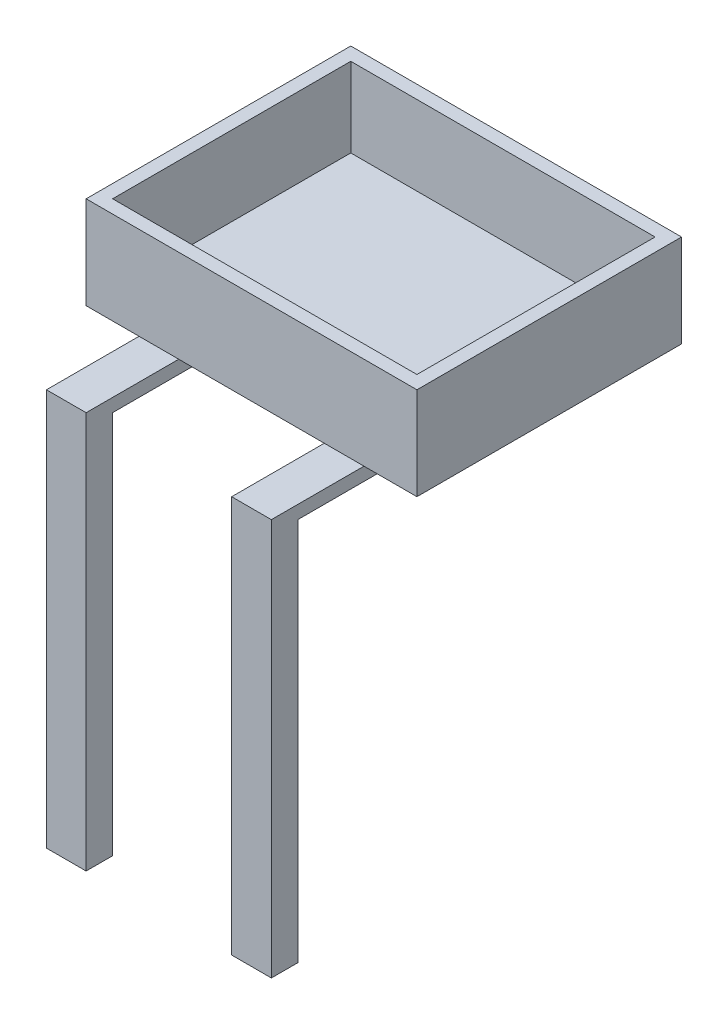
ISO-10303-21;
HEADER;
FILE_DESCRIPTION(('STEP AP214'),'2;1');
FILE_NAME('part.step','',(''),(''),'','','');
FILE_SCHEMA(('AUTOMOTIVE_DESIGN { 1 0 10303 214 1 1 1 1 }'));
ENDSEC;
DATA;
#1=APPLICATION_CONTEXT('core data for automotive mechanical design processes');
#2=APPLICATION_PROTOCOL_DEFINITION('international standard','automotive_design',2000,#1);
#3=PRODUCT_CONTEXT('',#1,'mechanical');
#4=PRODUCT('Part','Part','',(#3));
#5=PRODUCT_RELATED_PRODUCT_CATEGORY('part','',(#4));
#6=PRODUCT_DEFINITION_FORMATION('','',#4);
#7=PRODUCT_DEFINITION_CONTEXT('part definition',#1,'design');
#8=PRODUCT_DEFINITION('design','',#6,#7);
#9=PRODUCT_DEFINITION_SHAPE('','',#8);
#10=(LENGTH_UNIT() NAMED_UNIT(*) SI_UNIT(.MILLI.,.METRE.));
#11=(NAMED_UNIT(*) PLANE_ANGLE_UNIT() SI_UNIT($,.RADIAN.));
#12=(NAMED_UNIT(*) SI_UNIT($,.STERADIAN.) SOLID_ANGLE_UNIT());
#13=UNCERTAINTY_MEASURE_WITH_UNIT(LENGTH_MEASURE(1.E-05),#10,'distance_accuracy_value','');
#14=(GEOMETRIC_REPRESENTATION_CONTEXT(3) GLOBAL_UNCERTAINTY_ASSIGNED_CONTEXT((#13)) GLOBAL_UNIT_ASSIGNED_CONTEXT((#10,
#11,#12)) REPRESENTATION_CONTEXT('',''));
#15=CARTESIAN_POINT('',(0.,0.,0.));
#16=DIRECTION('',(0.,0.,1.));
#17=DIRECTION('',(1.,0.,0.));
#18=AXIS2_PLACEMENT_3D('',#15,#16,#17);
#19=CARTESIAN_POINT('',(0.,-10.,0.));
#20=DIRECTION('',(0.,1.,0.));
#21=DIRECTION('',(0.,0.,1.));
#22=AXIS2_PLACEMENT_3D('',#19,#20,#21);
#23=PLANE('',#22);
#24=DIRECTION('',(1.,0.,0.));
#25=VECTOR('',#24,1.);
#26=CARTESIAN_POINT('',(55.,-10.,150.));
#27=LINE('',#26,#25);
#28=CARTESIAN_POINT('',(55.,-10.,150.));
#29=VERTEX_POINT('',#28);
#30=CARTESIAN_POINT('',(85.,-10.,150.));
#31=VERTEX_POINT('',#30);
#32=EDGE_CURVE('E67',#29,#31,#27,.T.);
#33=ORIENTED_EDGE('',*,*,#32,.F.);
#34=DIRECTION('',(0.,0.,-1.));
#35=VECTOR('',#34,1.);
#36=CARTESIAN_POINT('',(55.,-10.,-100.));
#37=LINE('',#36,#35);
#38=CARTESIAN_POINT('',(55.,-10.,-100.));
#39=VERTEX_POINT('',#38);
#40=EDGE_CURVE('E271',#29,#39,#37,.T.);
#41=ORIENTED_EDGE('',*,*,#40,.T.);
#42=DIRECTION('',(1.,0.,0.));
#43=VECTOR('',#42,1.);
#44=CARTESIAN_POINT('',(55.,-10.,-100.));
#45=LINE('',#44,#43);
#46=CARTESIAN_POINT('',(85.,-10.,-100.));
#47=VERTEX_POINT('',#46);
#48=EDGE_CURVE('E281',#39,#47,#45,.T.);
#49=ORIENTED_EDGE('',*,*,#48,.T.);
#50=DIRECTION('',(0.,0.,1.));
#51=VECTOR('',#50,1.);
#52=CARTESIAN_POINT('',(85.,-10.,-100.));
#53=LINE('',#52,#51);
#54=EDGE_CURVE('E63',#47,#31,#53,.T.);
#55=ORIENTED_EDGE('',*,*,#54,.T.);
#56=EDGE_LOOP('',(#33,#41,#49,#55));
#57=FACE_BOUND('',#56,.T.);
#58=ADVANCED_FACE('F45',(#57),#23,.F.);
#59=CARTESIAN_POINT('',(0.,-10.,0.));
#60=DIRECTION('',(0.,1.,0.));
#61=DIRECTION('',(0.,0.,1.));
#62=AXIS2_PLACEMENT_3D('',#59,#60,#61);
#63=PLANE('',#62);
#64=DIRECTION('',(1.,0.,0.));
#65=VECTOR('',#64,1.);
#66=CARTESIAN_POINT('',(-85.,-10.,150.));
#67=LINE('',#66,#65);
#68=CARTESIAN_POINT('',(-85.,-10.,150.));
#69=VERTEX_POINT('',#68);
#70=CARTESIAN_POINT('',(-55.,-10.,150.));
#71=VERTEX_POINT('',#70);
#72=EDGE_CURVE('E228',#69,#71,#67,.T.);
#73=ORIENTED_EDGE('',*,*,#72,.F.);
#74=DIRECTION('',(0.,0.,-1.));
#75=VECTOR('',#74,1.);
#76=CARTESIAN_POINT('',(-85.,-10.,-100.));
#77=LINE('',#76,#75);
#78=CARTESIAN_POINT('',(-85.,-10.,-100.));
#79=VERTEX_POINT('',#78);
#80=EDGE_CURVE('E286',#69,#79,#77,.T.);
#81=ORIENTED_EDGE('',*,*,#80,.T.);
#82=DIRECTION('',(1.,0.,0.));
#83=VECTOR('',#82,1.);
#84=CARTESIAN_POINT('',(-85.,-10.,-100.));
#85=LINE('',#84,#83);
#86=CARTESIAN_POINT('',(-55.,-10.,-100.));
#87=VERTEX_POINT('',#86);
#88=EDGE_CURVE('E289',#79,#87,#85,.T.);
#89=ORIENTED_EDGE('',*,*,#88,.T.);
#90=DIRECTION('',(0.,0.,1.));
#91=VECTOR('',#90,1.);
#92=CARTESIAN_POINT('',(-55.,-10.,-100.));
#93=LINE('',#92,#91);
#94=EDGE_CURVE('E293',#87,#71,#93,.T.);
#95=ORIENTED_EDGE('',*,*,#94,.T.);
#96=EDGE_LOOP('',(#73,#81,#89,#95));
#97=FACE_BOUND('',#96,.T.);
#98=ADVANCED_FACE('F485',(#97),#63,.F.);
#99=CARTESIAN_POINT('',(0.,0.,0.));
#100=DIRECTION('',(0.,1.,0.));
#101=DIRECTION('',(0.,0.,1.));
#102=AXIS2_PLACEMENT_3D('',#99,#100,#101);
#103=PLANE('',#102);
#104=DIRECTION('',(0.,0.,-1.));
#105=VECTOR('',#104,1.);
#106=CARTESIAN_POINT('',(55.,0.,-100.));
#107=LINE('',#106,#105);
#108=CARTESIAN_POINT('',(55.,0.,100.));
#109=VERTEX_POINT('',#108);
#110=CARTESIAN_POINT('',(55.,0.,-100.));
#111=VERTEX_POINT('',#110);
#112=EDGE_CURVE('E275',#109,#111,#107,.T.);
#113=ORIENTED_EDGE('',*,*,#112,.F.);
#114=DIRECTION('',(1.,0.,0.));
#115=VECTOR('',#114,1.);
#116=CARTESIAN_POINT('',(-125.,0.,100.));
#117=LINE('',#116,#115);
#118=CARTESIAN_POINT('',(-55.,0.,100.));
#119=VERTEX_POINT('',#118);
#120=EDGE_CURVE('E438',#119,#109,#117,.T.);
#121=ORIENTED_EDGE('',*,*,#120,.F.);
#122=DIRECTION('',(0.,0.,1.));
#123=VECTOR('',#122,1.);
#124=CARTESIAN_POINT('',(-55.,0.,-100.));
#125=LINE('',#124,#123);
#126=CARTESIAN_POINT('',(-55.,0.,-100.));
#127=VERTEX_POINT('',#126);
#128=EDGE_CURVE('E300',#127,#119,#125,.T.);
#129=ORIENTED_EDGE('',*,*,#128,.F.);
#130=DIRECTION('',(-1.,0.,0.));
#131=VECTOR('',#130,1.);
#132=CARTESIAN_POINT('',(-125.,0.,-100.));
#133=LINE('',#132,#131);
#134=EDGE_CURVE('E388',#111,#127,#133,.T.);
#135=ORIENTED_EDGE('',*,*,#134,.F.);
#136=EDGE_LOOP('',(#113,#121,#129,#135));
#137=FACE_BOUND('',#136,.T.);
#138=ADVANCED_FACE('F452',(#137),#103,.F.);
#139=DIRECTION('',(0.,0.,1.));
#140=VECTOR('',#139,1.);
#141=CARTESIAN_POINT('',(85.,0.,-100.));
#142=LINE('',#141,#140);
#143=CARTESIAN_POINT('',(85.,0.,-100.));
#144=VERTEX_POINT('',#143);
#145=CARTESIAN_POINT('',(85.,0.,100.));
#146=VERTEX_POINT('',#145);
#147=EDGE_CURVE('E272',#144,#146,#142,.T.);
#148=ORIENTED_EDGE('',*,*,#147,.F.);
#149=CARTESIAN_POINT('',(125.,0.,-100.));
#150=VERTEX_POINT('',#149);
#151=EDGE_CURVE('E383',#150,#144,#133,.T.);
#152=ORIENTED_EDGE('',*,*,#151,.F.);
#153=DIRECTION('',(0.,0.,-1.));
#154=VECTOR('',#153,1.);
#155=CARTESIAN_POINT('',(125.,0.,-100.));
#156=LINE('',#155,#154);
#157=CARTESIAN_POINT('',(125.,0.,100.));
#158=VERTEX_POINT('',#157);
#159=EDGE_CURVE('E378',#158,#150,#156,.T.);
#160=ORIENTED_EDGE('',*,*,#159,.F.);
#161=EDGE_CURVE('E391',#146,#158,#117,.T.);
#162=ORIENTED_EDGE('',*,*,#161,.F.);
#163=EDGE_LOOP('',(#148,#152,#160,#162));
#164=FACE_BOUND('',#163,.T.);
#165=ADVANCED_FACE('F422',(#164),#103,.F.);
#166=DIRECTION('',(0.,0.,-1.));
#167=VECTOR('',#166,1.);
#168=CARTESIAN_POINT('',(-85.,0.,-100.));
#169=LINE('',#168,#167);
#170=CARTESIAN_POINT('',(-85.,0.,100.));
#171=VERTEX_POINT('',#170);
#172=CARTESIAN_POINT('',(-85.,0.,-100.));
#173=VERTEX_POINT('',#172);
#174=EDGE_CURVE('E11',#171,#173,#169,.T.);
#175=ORIENTED_EDGE('',*,*,#174,.F.);
#176=CARTESIAN_POINT('',(-125.,0.,100.));
#177=VERTEX_POINT('',#176);
#178=EDGE_CURVE('E392',#177,#171,#117,.T.);
#179=ORIENTED_EDGE('',*,*,#178,.F.);
#180=DIRECTION('',(0.,0.,1.));
#181=VECTOR('',#180,1.);
#182=CARTESIAN_POINT('',(-125.,0.,-100.));
#183=LINE('',#182,#181);
#184=CARTESIAN_POINT('',(-125.,0.,-100.));
#185=VERTEX_POINT('',#184);
#186=EDGE_CURVE('E387',#185,#177,#183,.T.);
#187=ORIENTED_EDGE('',*,*,#186,.F.);
#188=EDGE_CURVE('E382',#173,#185,#133,.T.);
#189=ORIENTED_EDGE('',*,*,#188,.F.);
#190=EDGE_LOOP('',(#175,#179,#187,#189));
#191=FACE_BOUND('',#190,.T.);
#192=ADVANCED_FACE('F532',(#191),#103,.F.);
#193=CARTESIAN_POINT('',(125.,10.,-100.));
#194=DIRECTION('',(-1.,0.,0.));
#195=DIRECTION('',(0.,0.,1.));
#196=AXIS2_PLACEMENT_3D('',#193,#194,#195);
#197=PLANE('',#196);
#198=ORIENTED_EDGE('',*,*,#159,.T.);
#199=DIRECTION('',(0.,-1.,0.));
#200=VECTOR('',#199,1.);
#201=CARTESIAN_POINT('',(125.,10.,-100.));
#202=LINE('',#201,#200);
#203=CARTESIAN_POINT('',(125.,70.,-100.));
#204=VERTEX_POINT('',#203);
#205=EDGE_CURVE('E49',#204,#150,#202,.T.);
#206=ORIENTED_EDGE('',*,*,#205,.F.);
#207=DIRECTION('',(0.,0.,-1.));
#208=VECTOR('',#207,1.);
#209=CARTESIAN_POINT('',(125.,70.,-100.));
#210=LINE('',#209,#208);
#211=CARTESIAN_POINT('',(125.,70.,100.));
#212=VERTEX_POINT('',#211);
#213=EDGE_CURVE('E362',#212,#204,#210,.T.);
#214=ORIENTED_EDGE('',*,*,#213,.F.);
#215=DIRECTION('',(0.,-1.,0.));
#216=VECTOR('',#215,1.);
#217=CARTESIAN_POINT('',(125.,10.,100.));
#218=LINE('',#217,#216);
#219=EDGE_CURVE('E396',#212,#158,#218,.T.);
#220=ORIENTED_EDGE('',*,*,#219,.T.);
#221=EDGE_LOOP('',(#198,#206,#214,#220));
#222=FACE_BOUND('',#221,.T.);
#223=ADVANCED_FACE('F47',(#222),#197,.F.);
#224=CARTESIAN_POINT('',(-125.,10.,-100.));
#225=DIRECTION('',(0.,0.,1.));
#226=DIRECTION('',(1.,0.,0.));
#227=AXIS2_PLACEMENT_3D('',#224,#225,#226);
#228=PLANE('',#227);
#229=ORIENTED_EDGE('',*,*,#151,.T.);
#230=DIRECTION('',(0.,1.,0.));
#231=VECTOR('',#230,1.);
#232=CARTESIAN_POINT('',(85.,-10.,-100.));
#233=LINE('',#232,#231);
#234=EDGE_CURVE('E263',#47,#144,#233,.T.);
#235=ORIENTED_EDGE('',*,*,#234,.F.);
#236=ORIENTED_EDGE('',*,*,#48,.F.);
#237=DIRECTION('',(0.,1.,0.));
#238=VECTOR('',#237,1.);
#239=CARTESIAN_POINT('',(55.,-10.,-100.));
#240=LINE('',#239,#238);
#241=EDGE_CURVE('E259',#39,#111,#240,.T.);
#242=ORIENTED_EDGE('',*,*,#241,.T.);
#243=ORIENTED_EDGE('',*,*,#134,.T.);
#244=DIRECTION('',(0.,1.,0.));
#245=VECTOR('',#244,1.);
#246=CARTESIAN_POINT('',(-55.,-10.,-100.));
#247=LINE('',#246,#245);
#248=EDGE_CURVE('E313',#87,#127,#247,.T.);
#249=ORIENTED_EDGE('',*,*,#248,.F.);
#250=ORIENTED_EDGE('',*,*,#88,.F.);
#251=DIRECTION('',(0.,1.,0.));
#252=VECTOR('',#251,1.);
#253=CARTESIAN_POINT('',(-85.,-10.,-100.));
#254=LINE('',#253,#252);
#255=EDGE_CURVE('E317',#79,#173,#254,.T.);
#256=ORIENTED_EDGE('',*,*,#255,.T.);
#257=ORIENTED_EDGE('',*,*,#188,.T.);
#258=DIRECTION('',(0.,-1.,0.));
#259=VECTOR('',#258,1.);
#260=CARTESIAN_POINT('',(-125.,10.,-100.));
#261=LINE('',#260,#259);
#262=CARTESIAN_POINT('',(-125.,70.,-100.));
#263=VERTEX_POINT('',#262);
#264=EDGE_CURVE('E404',#263,#185,#261,.T.);
#265=ORIENTED_EDGE('',*,*,#264,.F.);
#266=DIRECTION('',(-1.,0.,0.));
#267=VECTOR('',#266,1.);
#268=CARTESIAN_POINT('',(-125.,70.,-100.));
#269=LINE('',#268,#267);
#270=EDGE_CURVE('E366',#204,#263,#269,.T.);
#271=ORIENTED_EDGE('',*,*,#270,.F.);
#272=ORIENTED_EDGE('',*,*,#205,.T.);
#273=EDGE_LOOP('',(#229,#235,#236,#242,#243,#249,#250,#256,#257,#265,#271,#272));
#274=FACE_BOUND('',#273,.T.);
#275=ADVANCED_FACE('F414',(#274),#228,.F.);
#276=CARTESIAN_POINT('',(-125.,10.,-100.));
#277=DIRECTION('',(1.,0.,0.));
#278=DIRECTION('',(0.,0.,-1.));
#279=AXIS2_PLACEMENT_3D('',#276,#277,#278);
#280=PLANE('',#279);
#281=ORIENTED_EDGE('',*,*,#186,.T.);
#282=DIRECTION('',(0.,-1.,0.));
#283=VECTOR('',#282,1.);
#284=CARTESIAN_POINT('',(-125.,10.,100.));
#285=LINE('',#284,#283);
#286=CARTESIAN_POINT('',(-125.,70.,100.));
#287=VERTEX_POINT('',#286);
#288=EDGE_CURVE('E401',#287,#177,#285,.T.);
#289=ORIENTED_EDGE('',*,*,#288,.F.);
#290=DIRECTION('',(0.,0.,1.));
#291=VECTOR('',#290,1.);
#292=CARTESIAN_POINT('',(-125.,70.,-100.));
#293=LINE('',#292,#291);
#294=EDGE_CURVE('E370',#263,#287,#293,.T.);
#295=ORIENTED_EDGE('',*,*,#294,.F.);
#296=ORIENTED_EDGE('',*,*,#264,.T.);
#297=EDGE_LOOP('',(#281,#289,#295,#296));
#298=FACE_BOUND('',#297,.T.);
#299=ADVANCED_FACE('F538',(#298),#280,.F.);
#300=CARTESIAN_POINT('',(-125.,10.,100.));
#301=DIRECTION('',(0.,0.,-1.));
#302=DIRECTION('',(-1.,0.,0.));
#303=AXIS2_PLACEMENT_3D('',#300,#301,#302);
#304=PLANE('',#303);
#305=ORIENTED_EDGE('',*,*,#178,.T.);
#306=EDGE_CURVE('E397',#171,#119,#117,.T.);
#307=ORIENTED_EDGE('',*,*,#306,.T.);
#308=ORIENTED_EDGE('',*,*,#120,.T.);
#309=EDGE_CURVE('E429',#109,#146,#117,.T.);
#310=ORIENTED_EDGE('',*,*,#309,.T.);
#311=ORIENTED_EDGE('',*,*,#161,.T.);
#312=ORIENTED_EDGE('',*,*,#219,.F.);
#313=DIRECTION('',(1.,0.,0.));
#314=VECTOR('',#313,1.);
#315=CARTESIAN_POINT('',(-125.,70.,100.));
#316=LINE('',#315,#314);
#317=EDGE_CURVE('E374',#287,#212,#316,.T.);
#318=ORIENTED_EDGE('',*,*,#317,.F.);
#319=ORIENTED_EDGE('',*,*,#288,.T.);
#320=EDGE_LOOP('',(#305,#307,#308,#310,#311,#312,#318,#319));
#321=FACE_BOUND('',#320,.T.);
#322=ADVANCED_FACE('F444',(#321),#304,.F.);
#323=CARTESIAN_POINT('',(0.,70.,0.));
#324=DIRECTION('',(0.,1.,0.));
#325=DIRECTION('',(0.,0.,1.));
#326=AXIS2_PLACEMENT_3D('',#323,#324,#325);
#327=PLANE('',#326);
#328=ORIENTED_EDGE('',*,*,#213,.T.);
#329=ORIENTED_EDGE('',*,*,#270,.T.);
#330=ORIENTED_EDGE('',*,*,#294,.T.);
#331=ORIENTED_EDGE('',*,*,#317,.T.);
#332=EDGE_LOOP('',(#328,#329,#330,#331));
#333=FACE_BOUND('',#332,.T.);
#334=DIRECTION('',(-1.,0.,0.));
#335=VECTOR('',#334,1.);
#336=CARTESIAN_POINT('',(-115.,70.,-90.));
#337=LINE('',#336,#335);
#338=CARTESIAN_POINT('',(115.,70.,-90.));
#339=VERTEX_POINT('',#338);
#340=CARTESIAN_POINT('',(-115.,70.,-90.));
#341=VERTEX_POINT('',#340);
#342=EDGE_CURVE('E325',#339,#341,#337,.T.);
#343=ORIENTED_EDGE('',*,*,#342,.F.);
#344=DIRECTION('',(0.,0.,-1.));
#345=VECTOR('',#344,1.);
#346=CARTESIAN_POINT('',(115.,70.,-90.));
#347=LINE('',#346,#345);
#348=CARTESIAN_POINT('',(115.,70.,90.));
#349=VERTEX_POINT('',#348);
#350=EDGE_CURVE('E322',#349,#339,#347,.T.);
#351=ORIENTED_EDGE('',*,*,#350,.F.);
#352=DIRECTION('',(1.,0.,0.));
#353=VECTOR('',#352,1.);
#354=CARTESIAN_POINT('',(-115.,70.,90.));
#355=LINE('',#354,#353);
#356=CARTESIAN_POINT('',(-115.,70.,90.));
#357=VERTEX_POINT('',#356);
#358=EDGE_CURVE('E333',#357,#349,#355,.T.);
#359=ORIENTED_EDGE('',*,*,#358,.F.);
#360=DIRECTION('',(0.,0.,1.));
#361=VECTOR('',#360,1.);
#362=CARTESIAN_POINT('',(-115.,70.,-90.));
#363=LINE('',#362,#361);
#364=EDGE_CURVE('E329',#341,#357,#363,.T.);
#365=ORIENTED_EDGE('',*,*,#364,.F.);
#366=EDGE_LOOP('',(#343,#351,#359,#365));
#367=FACE_BOUND('',#366,.T.);
#368=ADVANCED_FACE('F524',(#333,#367),#327,.T.);
#369=CARTESIAN_POINT('',(115.,70.,-90.));
#370=DIRECTION('',(-1.,0.,0.));
#371=DIRECTION('',(0.,0.,1.));
#372=AXIS2_PLACEMENT_3D('',#369,#370,#371);
#373=PLANE('',#372);
#374=DIRECTION('',(0.,0.,-1.));
#375=VECTOR('',#374,1.);
#376=CARTESIAN_POINT('',(115.,10.,-90.));
#377=LINE('',#376,#375);
#378=CARTESIAN_POINT('',(115.,10.,90.));
#379=VERTEX_POINT('',#378);
#380=CARTESIAN_POINT('',(115.,10.,-90.));
#381=VERTEX_POINT('',#380);
#382=EDGE_CURVE('E321',#379,#381,#377,.T.);
#383=ORIENTED_EDGE('',*,*,#382,.F.);
#384=DIRECTION('',(0.,-1.,0.));
#385=VECTOR('',#384,1.);
#386=CARTESIAN_POINT('',(115.,70.,90.));
#387=LINE('',#386,#385);
#388=EDGE_CURVE('E336',#349,#379,#387,.T.);
#389=ORIENTED_EDGE('',*,*,#388,.F.);
#390=ORIENTED_EDGE('',*,*,#350,.T.);
#391=DIRECTION('',(0.,-1.,0.));
#392=VECTOR('',#391,1.);
#393=CARTESIAN_POINT('',(115.,70.,-90.));
#394=LINE('',#393,#392);
#395=EDGE_CURVE('E358',#339,#381,#394,.T.);
#396=ORIENTED_EDGE('',*,*,#395,.T.);
#397=EDGE_LOOP('',(#383,#389,#390,#396));
#398=FACE_BOUND('',#397,.T.);
#399=ADVANCED_FACE('F520',(#398),#373,.T.);
#400=CARTESIAN_POINT('',(-115.,70.,-90.));
#401=DIRECTION('',(0.,0.,1.));
#402=DIRECTION('',(1.,0.,0.));
#403=AXIS2_PLACEMENT_3D('',#400,#401,#402);
#404=PLANE('',#403);
#405=DIRECTION('',(-1.,0.,0.));
#406=VECTOR('',#405,1.);
#407=CARTESIAN_POINT('',(-115.,10.,-90.));
#408=LINE('',#407,#406);
#409=CARTESIAN_POINT('',(-115.,10.,-90.));
#410=VERTEX_POINT('',#409);
#411=EDGE_CURVE('E339',#381,#410,#408,.T.);
#412=ORIENTED_EDGE('',*,*,#411,.F.);
#413=ORIENTED_EDGE('',*,*,#395,.F.);
#414=ORIENTED_EDGE('',*,*,#342,.T.);
#415=DIRECTION('',(0.,-1.,0.));
#416=VECTOR('',#415,1.);
#417=CARTESIAN_POINT('',(-115.,70.,-90.));
#418=LINE('',#417,#416);
#419=EDGE_CURVE('E354',#341,#410,#418,.T.);
#420=ORIENTED_EDGE('',*,*,#419,.T.);
#421=EDGE_LOOP('',(#412,#413,#414,#420));
#422=FACE_BOUND('',#421,.T.);
#423=ADVANCED_FACE('F516',(#422),#404,.T.);
#424=CARTESIAN_POINT('',(-115.,70.,-90.));
#425=DIRECTION('',(1.,0.,0.));
#426=DIRECTION('',(0.,0.,-1.));
#427=AXIS2_PLACEMENT_3D('',#424,#425,#426);
#428=PLANE('',#427);
#429=DIRECTION('',(0.,0.,1.));
#430=VECTOR('',#429,1.);
#431=CARTESIAN_POINT('',(-115.,10.,-90.));
#432=LINE('',#431,#430);
#433=CARTESIAN_POINT('',(-115.,10.,90.));
#434=VERTEX_POINT('',#433);
#435=EDGE_CURVE('E342',#410,#434,#432,.T.);
#436=ORIENTED_EDGE('',*,*,#435,.F.);
#437=ORIENTED_EDGE('',*,*,#419,.F.);
#438=ORIENTED_EDGE('',*,*,#364,.T.);
#439=DIRECTION('',(0.,-1.,0.));
#440=VECTOR('',#439,1.);
#441=CARTESIAN_POINT('',(-115.,70.,90.));
#442=LINE('',#441,#440);
#443=EDGE_CURVE('E350',#357,#434,#442,.T.);
#444=ORIENTED_EDGE('',*,*,#443,.T.);
#445=EDGE_LOOP('',(#436,#437,#438,#444));
#446=FACE_BOUND('',#445,.T.);
#447=ADVANCED_FACE('F512',(#446),#428,.T.);
#448=CARTESIAN_POINT('',(-115.,70.,90.));
#449=DIRECTION('',(0.,0.,-1.));
#450=DIRECTION('',(-1.,0.,0.));
#451=AXIS2_PLACEMENT_3D('',#448,#449,#450);
#452=PLANE('',#451);
#453=DIRECTION('',(1.,0.,0.));
#454=VECTOR('',#453,1.);
#455=CARTESIAN_POINT('',(-115.,10.,90.));
#456=LINE('',#455,#454);
#457=EDGE_CURVE('E326',#434,#379,#456,.T.);
#458=ORIENTED_EDGE('',*,*,#457,.F.);
#459=ORIENTED_EDGE('',*,*,#443,.F.);
#460=ORIENTED_EDGE('',*,*,#358,.T.);
#461=ORIENTED_EDGE('',*,*,#388,.T.);
#462=EDGE_LOOP('',(#458,#459,#460,#461));
#463=FACE_BOUND('',#462,.T.);
#464=ADVANCED_FACE('F509',(#463),#452,.T.);
#465=CARTESIAN_POINT('',(0.,10.,0.));
#466=DIRECTION('',(0.,1.,0.));
#467=DIRECTION('',(0.,0.,1.));
#468=AXIS2_PLACEMENT_3D('',#465,#466,#467);
#469=PLANE('',#468);
#470=ORIENTED_EDGE('',*,*,#382,.T.);
#471=ORIENTED_EDGE('',*,*,#411,.T.);
#472=ORIENTED_EDGE('',*,*,#435,.T.);
#473=ORIENTED_EDGE('',*,*,#457,.T.);
#474=EDGE_LOOP('',(#470,#471,#472,#473));
#475=FACE_BOUND('',#474,.T.);
#476=ADVANCED_FACE('F499',(#475),#469,.T.);
#477=CARTESIAN_POINT('',(0.,0.,0.));
#478=DIRECTION('',(0.,1.,0.));
#479=DIRECTION('',(0.,0.,1.));
#480=AXIS2_PLACEMENT_3D('',#477,#478,#479);
#481=PLANE('',#480);
#482=ORIENTED_EDGE('',*,*,#306,.F.);
#483=CARTESIAN_POINT('',(-85.,0.,170.));
#484=VERTEX_POINT('',#483);
#485=EDGE_CURVE('E56',#484,#171,#169,.T.);
#486=ORIENTED_EDGE('',*,*,#485,.F.);
#487=DIRECTION('',(-1.,0.,0.));
#488=VECTOR('',#487,1.);
#489=CARTESIAN_POINT('',(-85.,0.,170.));
#490=LINE('',#489,#488);
#491=CARTESIAN_POINT('',(-55.,0.,170.));
#492=VERTEX_POINT('',#491);
#493=EDGE_CURVE('E290',#492,#484,#490,.T.);
#494=ORIENTED_EDGE('',*,*,#493,.F.);
#495=EDGE_CURVE('E299',#119,#492,#125,.T.);
#496=ORIENTED_EDGE('',*,*,#495,.F.);
#497=EDGE_LOOP('',(#482,#486,#494,#496));
#498=FACE_BOUND('',#497,.T.);
#499=ADVANCED_FACE('F455',(#498),#481,.T.);
#500=CARTESIAN_POINT('',(-85.,-10.,-100.));
#501=DIRECTION('',(1.,0.,0.));
#502=DIRECTION('',(0.,0.,-1.));
#503=AXIS2_PLACEMENT_3D('',#500,#501,#502);
#504=PLANE('',#503);
#505=ORIENTED_EDGE('',*,*,#485,.T.);
#506=ORIENTED_EDGE('',*,*,#174,.T.);
#507=ORIENTED_EDGE('',*,*,#255,.F.);
#508=ORIENTED_EDGE('',*,*,#80,.F.);
#509=DIRECTION('',(0.,1.,0.));
#510=VECTOR('',#509,1.);
#511=CARTESIAN_POINT('',(-85.,-300.,150.));
#512=LINE('',#511,#510);
#513=CARTESIAN_POINT('',(-85.,-300.,150.));
#514=VERTEX_POINT('',#513);
#515=EDGE_CURVE('E255',#514,#69,#512,.T.);
#516=ORIENTED_EDGE('',*,*,#515,.F.);
#517=DIRECTION('',(0.,0.,-1.));
#518=VECTOR('',#517,1.);
#519=CARTESIAN_POINT('',(-85.,-300.,170.));
#520=LINE('',#519,#518);
#521=CARTESIAN_POINT('',(-85.,-300.,170.));
#522=VERTEX_POINT('',#521);
#523=EDGE_CURVE('E233',#522,#514,#520,.T.);
#524=ORIENTED_EDGE('',*,*,#523,.F.);
#525=DIRECTION('',(0.,1.,0.));
#526=VECTOR('',#525,1.);
#527=CARTESIAN_POINT('',(-85.,-10.,170.));
#528=LINE('',#527,#526);
#529=EDGE_CURVE('E295',#522,#484,#528,.T.);
#530=ORIENTED_EDGE('',*,*,#529,.T.);
#531=EDGE_LOOP('',(#505,#506,#507,#508,#516,#524,#530));
#532=FACE_BOUND('',#531,.T.);
#533=ADVANCED_FACE('F498',(#532),#504,.F.);
#534=CARTESIAN_POINT('',(-55.,-10.,-100.));
#535=DIRECTION('',(-1.,0.,0.));
#536=DIRECTION('',(0.,0.,1.));
#537=AXIS2_PLACEMENT_3D('',#534,#535,#536);
#538=PLANE('',#537);
#539=ORIENTED_EDGE('',*,*,#128,.T.);
#540=ORIENTED_EDGE('',*,*,#495,.T.);
#541=DIRECTION('',(0.,1.,0.));
#542=VECTOR('',#541,1.);
#543=CARTESIAN_POINT('',(-55.,-10.,170.));
#544=LINE('',#543,#542);
#545=CARTESIAN_POINT('',(-55.,-300.,170.));
#546=VERTEX_POINT('',#545);
#547=EDGE_CURVE('E309',#546,#492,#544,.T.);
#548=ORIENTED_EDGE('',*,*,#547,.F.);
#549=DIRECTION('',(0.,0.,1.));
#550=VECTOR('',#549,1.);
#551=CARTESIAN_POINT('',(-55.,-300.,170.));
#552=LINE('',#551,#550);
#553=CARTESIAN_POINT('',(-55.,-300.,150.));
#554=VERTEX_POINT('',#553);
#555=EDGE_CURVE('E240',#554,#546,#552,.T.);
#556=ORIENTED_EDGE('',*,*,#555,.F.);
#557=DIRECTION('',(0.,1.,0.));
#558=VECTOR('',#557,1.);
#559=CARTESIAN_POINT('',(-55.,-300.,150.));
#560=LINE('',#559,#558);
#561=EDGE_CURVE('E248',#554,#71,#560,.T.);
#562=ORIENTED_EDGE('',*,*,#561,.T.);
#563=ORIENTED_EDGE('',*,*,#94,.F.);
#564=ORIENTED_EDGE('',*,*,#248,.T.);
#565=EDGE_LOOP('',(#539,#540,#548,#556,#562,#563,#564));
#566=FACE_BOUND('',#565,.T.);
#567=ADVANCED_FACE('F457',(#566),#538,.F.);
#568=CARTESIAN_POINT('',(-85.,-10.,170.));
#569=DIRECTION('',(0.,0.,-1.));
#570=DIRECTION('',(-1.,0.,0.));
#571=AXIS2_PLACEMENT_3D('',#568,#569,#570);
#572=PLANE('',#571);
#573=ORIENTED_EDGE('',*,*,#493,.T.);
#574=ORIENTED_EDGE('',*,*,#529,.F.);
#575=DIRECTION('',(-1.,0.,0.));
#576=VECTOR('',#575,1.);
#577=CARTESIAN_POINT('',(-85.,-300.,170.));
#578=LINE('',#577,#576);
#579=EDGE_CURVE('E244',#546,#522,#578,.T.);
#580=ORIENTED_EDGE('',*,*,#579,.F.);
#581=ORIENTED_EDGE('',*,*,#547,.T.);
#582=EDGE_LOOP('',(#573,#574,#580,#581));
#583=FACE_BOUND('',#582,.T.);
#584=ADVANCED_FACE('F500',(#583),#572,.F.);
#585=CARTESIAN_POINT('',(0.,0.,0.));
#586=DIRECTION('',(0.,1.,0.));
#587=DIRECTION('',(0.,0.,1.));
#588=AXIS2_PLACEMENT_3D('',#585,#586,#587);
#589=PLANE('',#588);
#590=ORIENTED_EDGE('',*,*,#309,.F.);
#591=CARTESIAN_POINT('',(55.,0.,170.));
#592=VERTEX_POINT('',#591);
#593=EDGE_CURVE('E276',#592,#109,#107,.T.);
#594=ORIENTED_EDGE('',*,*,#593,.F.);
#595=DIRECTION('',(-1.,0.,0.));
#596=VECTOR('',#595,1.);
#597=CARTESIAN_POINT('',(55.,0.,170.));
#598=LINE('',#597,#596);
#599=CARTESIAN_POINT('',(85.,0.,170.));
#600=VERTEX_POINT('',#599);
#601=EDGE_CURVE('E201',#600,#592,#598,.T.);
#602=ORIENTED_EDGE('',*,*,#601,.F.);
#603=EDGE_CURVE('E270',#146,#600,#142,.T.);
#604=ORIENTED_EDGE('',*,*,#603,.F.);
#605=EDGE_LOOP('',(#590,#594,#602,#604));
#606=FACE_BOUND('',#605,.T.);
#607=ADVANCED_FACE('F428',(#606),#589,.T.);
#608=CARTESIAN_POINT('',(55.,-10.,-100.));
#609=DIRECTION('',(1.,0.,0.));
#610=DIRECTION('',(0.,0.,-1.));
#611=AXIS2_PLACEMENT_3D('',#608,#609,#610);
#612=PLANE('',#611);
#613=ORIENTED_EDGE('',*,*,#593,.T.);
#614=ORIENTED_EDGE('',*,*,#112,.T.);
#615=ORIENTED_EDGE('',*,*,#241,.F.);
#616=ORIENTED_EDGE('',*,*,#40,.F.);
#617=DIRECTION('',(0.,1.,0.));
#618=VECTOR('',#617,1.);
#619=CARTESIAN_POINT('',(55.,-300.,150.));
#620=LINE('',#619,#618);
#621=CARTESIAN_POINT('',(55.,-300.,150.));
#622=VERTEX_POINT('',#621);
#623=EDGE_CURVE('E222',#622,#29,#620,.T.);
#624=ORIENTED_EDGE('',*,*,#623,.F.);
#625=DIRECTION('',(0.,0.,-1.));
#626=VECTOR('',#625,1.);
#627=CARTESIAN_POINT('',(55.,-300.,170.));
#628=LINE('',#627,#626);
#629=CARTESIAN_POINT('',(55.,-300.,170.));
#630=VERTEX_POINT('',#629);
#631=EDGE_CURVE('E213',#630,#622,#628,.T.);
#632=ORIENTED_EDGE('',*,*,#631,.F.);
#633=DIRECTION('',(0.,1.,0.));
#634=VECTOR('',#633,1.);
#635=CARTESIAN_POINT('',(55.,-10.,170.));
#636=LINE('',#635,#634);
#637=EDGE_CURVE('E195',#630,#592,#636,.T.);
#638=ORIENTED_EDGE('',*,*,#637,.T.);
#639=EDGE_LOOP('',(#613,#614,#615,#616,#624,#632,#638));
#640=FACE_BOUND('',#639,.T.);
#641=ADVANCED_FACE('F220',(#640),#612,.F.);
#642=CARTESIAN_POINT('',(85.,-10.,-100.));
#643=DIRECTION('',(-1.,0.,0.));
#644=DIRECTION('',(0.,0.,1.));
#645=AXIS2_PLACEMENT_3D('',#642,#643,#644);
#646=PLANE('',#645);
#647=ORIENTED_EDGE('',*,*,#147,.T.);
#648=ORIENTED_EDGE('',*,*,#603,.T.);
#649=DIRECTION('',(0.,1.,0.));
#650=VECTOR('',#649,1.);
#651=CARTESIAN_POINT('',(85.,-10.,170.));
#652=LINE('',#651,#650);
#653=CARTESIAN_POINT('',(85.,-300.,170.));
#654=VERTEX_POINT('',#653);
#655=EDGE_CURVE('E207',#654,#600,#652,.T.);
#656=ORIENTED_EDGE('',*,*,#655,.F.);
#657=DIRECTION('',(0.,0.,1.));
#658=VECTOR('',#657,1.);
#659=CARTESIAN_POINT('',(85.,-300.,170.));
#660=LINE('',#659,#658);
#661=CARTESIAN_POINT('',(85.,-300.,150.));
#662=VERTEX_POINT('',#661);
#663=EDGE_CURVE('E216',#662,#654,#660,.T.);
#664=ORIENTED_EDGE('',*,*,#663,.F.);
#665=DIRECTION('',(0.,1.,0.));
#666=VECTOR('',#665,1.);
#667=CARTESIAN_POINT('',(85.,-300.,150.));
#668=LINE('',#667,#666);
#669=EDGE_CURVE('E218',#662,#31,#668,.T.);
#670=ORIENTED_EDGE('',*,*,#669,.T.);
#671=ORIENTED_EDGE('',*,*,#54,.F.);
#672=ORIENTED_EDGE('',*,*,#234,.T.);
#673=EDGE_LOOP('',(#647,#648,#656,#664,#670,#671,#672));
#674=FACE_BOUND('',#673,.T.);
#675=ADVANCED_FACE('F426',(#674),#646,.F.);
#676=CARTESIAN_POINT('',(55.,-10.,170.));
#677=DIRECTION('',(0.,0.,-1.));
#678=DIRECTION('',(-1.,0.,0.));
#679=AXIS2_PLACEMENT_3D('',#676,#677,#678);
#680=PLANE('',#679);
#681=ORIENTED_EDGE('',*,*,#601,.T.);
#682=ORIENTED_EDGE('',*,*,#637,.F.);
#683=DIRECTION('',(-1.,0.,0.));
#684=VECTOR('',#683,1.);
#685=CARTESIAN_POINT('',(55.,-300.,170.));
#686=LINE('',#685,#684);
#687=EDGE_CURVE('E199',#654,#630,#686,.T.);
#688=ORIENTED_EDGE('',*,*,#687,.F.);
#689=ORIENTED_EDGE('',*,*,#655,.T.);
#690=EDGE_LOOP('',(#681,#682,#688,#689));
#691=FACE_BOUND('',#690,.T.);
#692=ADVANCED_FACE('F197',(#691),#680,.F.);
#693=CARTESIAN_POINT('',(-85.,-300.,150.));
#694=DIRECTION('',(0.,0.,1.));
#695=DIRECTION('',(1.,0.,0.));
#696=AXIS2_PLACEMENT_3D('',#693,#694,#695);
#697=PLANE('',#696);
#698=ORIENTED_EDGE('',*,*,#72,.T.);
#699=ORIENTED_EDGE('',*,*,#561,.F.);
#700=DIRECTION('',(1.,0.,0.));
#701=VECTOR('',#700,1.);
#702=CARTESIAN_POINT('',(-85.,-300.,150.));
#703=LINE('',#702,#701);
#704=EDGE_CURVE('E237',#514,#554,#703,.T.);
#705=ORIENTED_EDGE('',*,*,#704,.F.);
#706=ORIENTED_EDGE('',*,*,#515,.T.);
#707=EDGE_LOOP('',(#698,#699,#705,#706));
#708=FACE_BOUND('',#707,.T.);
#709=ADVANCED_FACE('F481',(#708),#697,.F.);
#710=CARTESIAN_POINT('',(0.,-300.,0.));
#711=DIRECTION('',(0.,-1.,0.));
#712=DIRECTION('',(0.,0.,-1.));
#713=AXIS2_PLACEMENT_3D('',#710,#711,#712);
#714=PLANE('',#713);
#715=ORIENTED_EDGE('',*,*,#523,.T.);
#716=ORIENTED_EDGE('',*,*,#704,.T.);
#717=ORIENTED_EDGE('',*,*,#555,.T.);
#718=ORIENTED_EDGE('',*,*,#579,.T.);
#719=EDGE_LOOP('',(#715,#716,#717,#718));
#720=FACE_BOUND('',#719,.T.);
#721=ADVANCED_FACE('F474',(#720),#714,.T.);
#722=CARTESIAN_POINT('',(55.,-300.,150.));
#723=DIRECTION('',(0.,0.,1.));
#724=DIRECTION('',(1.,0.,0.));
#725=AXIS2_PLACEMENT_3D('',#722,#723,#724);
#726=PLANE('',#725);
#727=ORIENTED_EDGE('',*,*,#32,.T.);
#728=ORIENTED_EDGE('',*,*,#669,.F.);
#729=DIRECTION('',(1.,0.,0.));
#730=VECTOR('',#729,1.);
#731=CARTESIAN_POINT('',(55.,-300.,150.));
#732=LINE('',#731,#730);
#733=EDGE_CURVE('E224',#622,#662,#732,.T.);
#734=ORIENTED_EDGE('',*,*,#733,.F.);
#735=ORIENTED_EDGE('',*,*,#623,.T.);
#736=EDGE_LOOP('',(#727,#728,#734,#735));
#737=FACE_BOUND('',#736,.T.);
#738=ADVANCED_FACE('F465',(#737),#726,.F.);
#739=CARTESIAN_POINT('',(0.,-300.,0.));
#740=DIRECTION('',(0.,-1.,0.));
#741=DIRECTION('',(0.,0.,-1.));
#742=AXIS2_PLACEMENT_3D('',#739,#740,#741);
#743=PLANE('',#742);
#744=ORIENTED_EDGE('',*,*,#631,.T.);
#745=ORIENTED_EDGE('',*,*,#733,.T.);
#746=ORIENTED_EDGE('',*,*,#663,.T.);
#747=ORIENTED_EDGE('',*,*,#687,.T.);
#748=EDGE_LOOP('',(#744,#745,#746,#747));
#749=FACE_BOUND('',#748,.T.);
#750=ADVANCED_FACE('F212',(#749),#743,.T.);
#751=CLOSED_SHELL('',(#58,#98,#138,#165,#192,#223,#275,#299,#322,#368,#399,#423,#447,#464,#476,
#499,#533,#567,#584,#607,#641,#675,#692,#709,#721,#738,#750));
#752=MANIFOLD_SOLID_BREP('B2',#751);
#753=ADVANCED_BREP_SHAPE_REPRESENTATION('',(#18,#752),#14);
#754=SHAPE_DEFINITION_REPRESENTATION(#9,#753);
ENDSEC;
END-ISO-10303-21;
